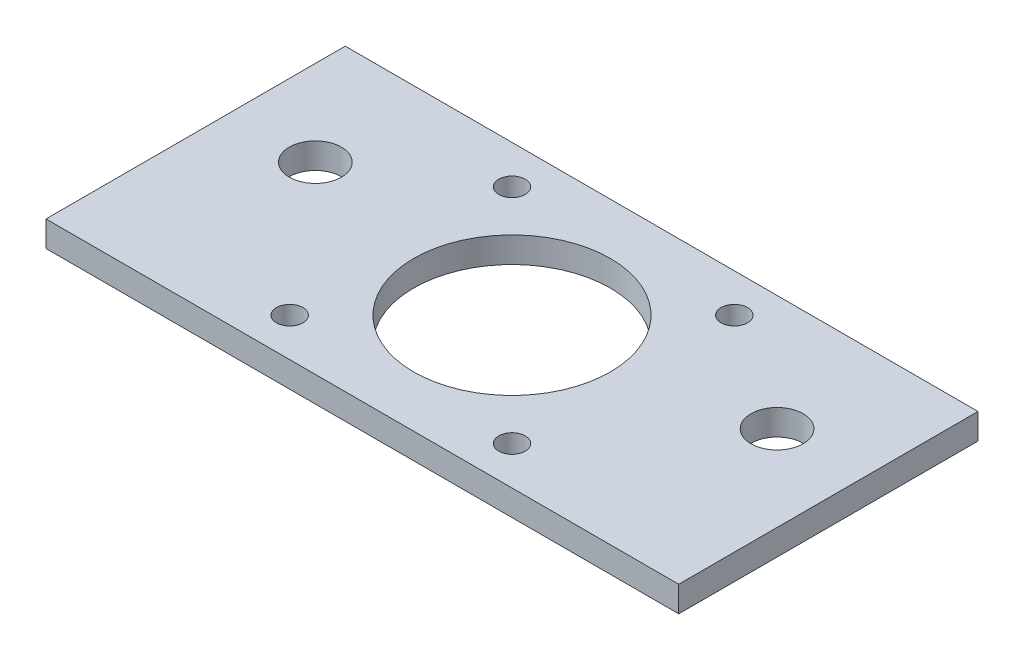
ISO-10303-21;
HEADER;
FILE_DESCRIPTION(('STEP AP214'),'2;1');
FILE_NAME('part.step','',(''),(''),'','','');
FILE_SCHEMA(('AUTOMOTIVE_DESIGN { 1 0 10303 214 1 1 1 1 }'));
ENDSEC;
DATA;
#1=APPLICATION_CONTEXT('core data for automotive mechanical design processes');
#2=APPLICATION_PROTOCOL_DEFINITION('international standard','automotive_design',2000,#1);
#3=PRODUCT_CONTEXT('',#1,'mechanical');
#4=PRODUCT('Part','Part','',(#3));
#5=PRODUCT_RELATED_PRODUCT_CATEGORY('part','',(#4));
#6=PRODUCT_DEFINITION_FORMATION('','',#4);
#7=PRODUCT_DEFINITION_CONTEXT('part definition',#1,'design');
#8=PRODUCT_DEFINITION('design','',#6,#7);
#9=PRODUCT_DEFINITION_SHAPE('','',#8);
#10=(LENGTH_UNIT() NAMED_UNIT(*) SI_UNIT(.MILLI.,.METRE.));
#11=(NAMED_UNIT(*) PLANE_ANGLE_UNIT() SI_UNIT($,.RADIAN.));
#12=(NAMED_UNIT(*) SI_UNIT($,.STERADIAN.) SOLID_ANGLE_UNIT());
#13=UNCERTAINTY_MEASURE_WITH_UNIT(LENGTH_MEASURE(1.E-05),#10,'distance_accuracy_value','');
#14=(GEOMETRIC_REPRESENTATION_CONTEXT(3) GLOBAL_UNCERTAINTY_ASSIGNED_CONTEXT((#13)) GLOBAL_UNIT_ASSIGNED_CONTEXT((#10,
#11,#12)) REPRESENTATION_CONTEXT('',''));
#15=CARTESIAN_POINT('',(0.,0.,0.));
#16=DIRECTION('',(0.,0.,1.));
#17=DIRECTION('',(1.,0.,0.));
#18=AXIS2_PLACEMENT_3D('',#15,#16,#17);
#19=CARTESIAN_POINT('',(37.,3.,-17.5));
#20=DIRECTION('',(-1.,0.,0.));
#21=DIRECTION('',(0.,0.,1.));
#22=AXIS2_PLACEMENT_3D('',#19,#20,#21);
#23=PLANE('',#22);
#24=DIRECTION('',(0.,0.,-1.));
#25=VECTOR('',#24,1.);
#26=CARTESIAN_POINT('',(37.,0.,-17.5));
#27=LINE('',#26,#25);
#28=CARTESIAN_POINT('',(37.,0.,17.5));
#29=VERTEX_POINT('',#28);
#30=CARTESIAN_POINT('',(37.,0.,-17.5));
#31=VERTEX_POINT('',#30);
#32=EDGE_CURVE('E109',#29,#31,#27,.T.);
#33=ORIENTED_EDGE('',*,*,#32,.T.);
#34=DIRECTION('',(0.,-1.,0.));
#35=VECTOR('',#34,1.);
#36=CARTESIAN_POINT('',(37.,3.,-17.5));
#37=LINE('',#36,#35);
#38=CARTESIAN_POINT('',(37.,3.,-17.5));
#39=VERTEX_POINT('',#38);
#40=EDGE_CURVE('E11',#39,#31,#37,.T.);
#41=ORIENTED_EDGE('',*,*,#40,.F.);
#42=DIRECTION('',(0.,0.,-1.));
#43=VECTOR('',#42,1.);
#44=CARTESIAN_POINT('',(37.,3.,-17.5));
#45=LINE('',#44,#43);
#46=CARTESIAN_POINT('',(37.,3.,17.5));
#47=VERTEX_POINT('',#46);
#48=EDGE_CURVE('E92',#47,#39,#45,.T.);
#49=ORIENTED_EDGE('',*,*,#48,.F.);
#50=DIRECTION('',(0.,-1.,0.));
#51=VECTOR('',#50,1.);
#52=CARTESIAN_POINT('',(37.,3.,17.5));
#53=LINE('',#52,#51);
#54=EDGE_CURVE('E105',#47,#29,#53,.T.);
#55=ORIENTED_EDGE('',*,*,#54,.T.);
#56=EDGE_LOOP('',(#33,#41,#49,#55));
#57=FACE_BOUND('',#56,.T.);
#58=ADVANCED_FACE('F38',(#57),#23,.F.);
#59=CARTESIAN_POINT('',(-37.,3.,-17.5));
#60=DIRECTION('',(0.,0.,1.));
#61=DIRECTION('',(1.,0.,0.));
#62=AXIS2_PLACEMENT_3D('',#59,#60,#61);
#63=PLANE('',#62);
#64=DIRECTION('',(-1.,0.,0.));
#65=VECTOR('',#64,1.);
#66=CARTESIAN_POINT('',(-37.,0.,-17.5));
#67=LINE('',#66,#65);
#68=CARTESIAN_POINT('',(-37.,0.,-17.5));
#69=VERTEX_POINT('',#68);
#70=EDGE_CURVE('E97',#31,#69,#67,.T.);
#71=ORIENTED_EDGE('',*,*,#70,.T.);
#72=DIRECTION('',(0.,-1.,0.));
#73=VECTOR('',#72,1.);
#74=CARTESIAN_POINT('',(-37.,3.,-17.5));
#75=LINE('',#74,#73);
#76=CARTESIAN_POINT('',(-37.,3.,-17.5));
#77=VERTEX_POINT('',#76);
#78=EDGE_CURVE('E48',#77,#69,#75,.T.);
#79=ORIENTED_EDGE('',*,*,#78,.F.);
#80=DIRECTION('',(-1.,0.,0.));
#81=VECTOR('',#80,1.);
#82=CARTESIAN_POINT('',(-37.,3.,-17.5));
#83=LINE('',#82,#81);
#84=EDGE_CURVE('E87',#39,#77,#83,.T.);
#85=ORIENTED_EDGE('',*,*,#84,.F.);
#86=ORIENTED_EDGE('',*,*,#40,.T.);
#87=EDGE_LOOP('',(#71,#79,#85,#86));
#88=FACE_BOUND('',#87,.T.);
#89=ADVANCED_FACE('F96',(#88),#63,.F.);
#90=CARTESIAN_POINT('',(-37.,3.,-17.5));
#91=DIRECTION('',(1.,0.,0.));
#92=DIRECTION('',(0.,0.,-1.));
#93=AXIS2_PLACEMENT_3D('',#90,#91,#92);
#94=PLANE('',#93);
#95=DIRECTION('',(0.,0.,1.));
#96=VECTOR('',#95,1.);
#97=CARTESIAN_POINT('',(-37.,0.,-17.5));
#98=LINE('',#97,#96);
#99=CARTESIAN_POINT('',(-37.,0.,17.5));
#100=VERTEX_POINT('',#99);
#101=EDGE_CURVE('E74',#69,#100,#98,.T.);
#102=ORIENTED_EDGE('',*,*,#101,.T.);
#103=DIRECTION('',(0.,-1.,0.));
#104=VECTOR('',#103,1.);
#105=CARTESIAN_POINT('',(-37.,3.,17.5));
#106=LINE('',#105,#104);
#107=CARTESIAN_POINT('',(-37.,3.,17.5));
#108=VERTEX_POINT('',#107);
#109=EDGE_CURVE('E99',#108,#100,#106,.T.);
#110=ORIENTED_EDGE('',*,*,#109,.F.);
#111=DIRECTION('',(0.,0.,1.));
#112=VECTOR('',#111,1.);
#113=CARTESIAN_POINT('',(-37.,3.,-17.5));
#114=LINE('',#113,#112);
#115=EDGE_CURVE('E90',#77,#108,#114,.T.);
#116=ORIENTED_EDGE('',*,*,#115,.F.);
#117=ORIENTED_EDGE('',*,*,#78,.T.);
#118=EDGE_LOOP('',(#102,#110,#116,#117));
#119=FACE_BOUND('',#118,.T.);
#120=ADVANCED_FACE('F101',(#119),#94,.F.);
#121=CARTESIAN_POINT('',(-37.,3.,17.5));
#122=DIRECTION('',(0.,0.,-1.));
#123=DIRECTION('',(-1.,0.,0.));
#124=AXIS2_PLACEMENT_3D('',#121,#122,#123);
#125=PLANE('',#124);
#126=DIRECTION('',(1.,0.,0.));
#127=VECTOR('',#126,1.);
#128=CARTESIAN_POINT('',(-37.,0.,17.5));
#129=LINE('',#128,#127);
#130=EDGE_CURVE('E80',#100,#29,#129,.T.);
#131=ORIENTED_EDGE('',*,*,#130,.T.);
#132=ORIENTED_EDGE('',*,*,#54,.F.);
#133=DIRECTION('',(1.,0.,0.));
#134=VECTOR('',#133,1.);
#135=CARTESIAN_POINT('',(-37.,3.,17.5));
#136=LINE('',#135,#134);
#137=EDGE_CURVE('E57',#108,#47,#136,.T.);
#138=ORIENTED_EDGE('',*,*,#137,.F.);
#139=ORIENTED_EDGE('',*,*,#109,.T.);
#140=EDGE_LOOP('',(#131,#132,#138,#139));
#141=FACE_BOUND('',#140,.T.);
#142=ADVANCED_FACE('F183',(#141),#125,.F.);
#143=CARTESIAN_POINT('',(0.,3.,0.));
#144=DIRECTION('',(0.,1.,0.));
#145=DIRECTION('',(0.,0.,1.));
#146=AXIS2_PLACEMENT_3D('',#143,#144,#145);
#147=PLANE('',#146);
#148=CARTESIAN_POINT('',(0.,3.,0.));
#149=DIRECTION('',(0.,1.,0.));
#150=DIRECTION('',(0.,0.,1.));
#151=AXIS2_PLACEMENT_3D('',#148,#149,#150);
#152=CIRCLE('',#151,11.5);
#153=CARTESIAN_POINT('',(0.,3.,11.5));
#154=VERTEX_POINT('',#153);
#155=EDGE_CURVE('E140',#154,#154,#152,.T.);
#156=ORIENTED_EDGE('',*,*,#155,.F.);
#157=EDGE_LOOP('',(#156));
#158=FACE_BOUND('',#157,.T.);
#159=CARTESIAN_POINT('',(-26.9999999999999,3.,-3.99999999999953));
#160=DIRECTION('',(0.,1.,0.));
#161=DIRECTION('',(0.,0.,1.));
#162=AXIS2_PLACEMENT_3D('',#159,#160,#161);
#163=CIRCLE('',#162,3.05);
#164=CARTESIAN_POINT('',(-26.9999999999999,3.,-0.949999999999527));
#165=VERTEX_POINT('',#164);
#166=EDGE_CURVE('E126',#165,#165,#163,.T.);
#167=ORIENTED_EDGE('',*,*,#166,.F.);
#168=EDGE_LOOP('',(#167));
#169=FACE_BOUND('',#168,.T.);
#170=CARTESIAN_POINT('',(27.,3.,-3.99999999999948));
#171=DIRECTION('',(0.,1.,0.));
#172=DIRECTION('',(0.,0.,1.));
#173=AXIS2_PLACEMENT_3D('',#170,#171,#172);
#174=CIRCLE('',#173,3.05);
#175=CARTESIAN_POINT('',(27.,3.,-0.949999999999474));
#176=VERTEX_POINT('',#175);
#177=EDGE_CURVE('E134',#176,#176,#174,.T.);
#178=ORIENTED_EDGE('',*,*,#177,.F.);
#179=EDGE_LOOP('',(#178));
#180=FACE_BOUND('',#179,.T.);
#181=CARTESIAN_POINT('',(-13.,3.,-13.));
#182=DIRECTION('',(0.,1.,0.));
#183=DIRECTION('',(0.,0.,1.));
#184=AXIS2_PLACEMENT_3D('',#181,#182,#183);
#185=CIRCLE('',#184,1.55);
#186=CARTESIAN_POINT('',(-13.,3.,-11.45));
#187=VERTEX_POINT('',#186);
#188=EDGE_CURVE('E113',#187,#187,#185,.T.);
#189=ORIENTED_EDGE('',*,*,#188,.F.);
#190=EDGE_LOOP('',(#189));
#191=FACE_BOUND('',#190,.T.);
#192=CARTESIAN_POINT('',(13.,3.,-13.));
#193=DIRECTION('',(0.,1.,0.));
#194=DIRECTION('',(0.,0.,1.));
#195=AXIS2_PLACEMENT_3D('',#192,#193,#194);
#196=CIRCLE('',#195,1.55);
#197=CARTESIAN_POINT('',(13.,3.,-11.45));
#198=VERTEX_POINT('',#197);
#199=EDGE_CURVE('E168',#198,#198,#196,.T.);
#200=ORIENTED_EDGE('',*,*,#199,.F.);
#201=EDGE_LOOP('',(#200));
#202=FACE_BOUND('',#201,.T.);
#203=CARTESIAN_POINT('',(13.,3.,13.));
#204=DIRECTION('',(0.,1.,0.));
#205=DIRECTION('',(0.,0.,1.));
#206=AXIS2_PLACEMENT_3D('',#203,#204,#205);
#207=CIRCLE('',#206,1.55);
#208=CARTESIAN_POINT('',(13.,3.,14.55));
#209=VERTEX_POINT('',#208);
#210=EDGE_CURVE('E164',#209,#209,#207,.T.);
#211=ORIENTED_EDGE('',*,*,#210,.F.);
#212=EDGE_LOOP('',(#211));
#213=FACE_BOUND('',#212,.T.);
#214=CARTESIAN_POINT('',(-13.,3.,13.));
#215=DIRECTION('',(0.,1.,0.));
#216=DIRECTION('',(0.,0.,1.));
#217=AXIS2_PLACEMENT_3D('',#214,#215,#216);
#218=CIRCLE('',#217,1.55);
#219=CARTESIAN_POINT('',(-13.,3.,14.55));
#220=VERTEX_POINT('',#219);
#221=EDGE_CURVE('E160',#220,#220,#218,.T.);
#222=ORIENTED_EDGE('',*,*,#221,.F.);
#223=EDGE_LOOP('',(#222));
#224=FACE_BOUND('',#223,.T.);
#225=ORIENTED_EDGE('',*,*,#48,.T.);
#226=ORIENTED_EDGE('',*,*,#84,.T.);
#227=ORIENTED_EDGE('',*,*,#115,.T.);
#228=ORIENTED_EDGE('',*,*,#137,.T.);
#229=EDGE_LOOP('',(#225,#226,#227,#228));
#230=FACE_BOUND('',#229,.T.);
#231=ADVANCED_FACE('F88',(#158,#169,#180,#191,#202,#213,#224,#230),#147,.T.);
#232=CARTESIAN_POINT('',(0.,0.,0.));
#233=DIRECTION('',(0.,1.,0.));
#234=DIRECTION('',(0.,0.,1.));
#235=AXIS2_PLACEMENT_3D('',#232,#233,#234);
#236=PLANE('',#235);
#237=CARTESIAN_POINT('',(0.,0.,0.));
#238=DIRECTION('',(0.,-1.,0.));
#239=DIRECTION('',(0.,0.,-1.));
#240=AXIS2_PLACEMENT_3D('',#237,#238,#239);
#241=CIRCLE('',#240,11.5);
#242=CARTESIAN_POINT('',(0.,0.,-11.5));
#243=VERTEX_POINT('',#242);
#244=EDGE_CURVE('E304',#243,#243,#241,.T.);
#245=ORIENTED_EDGE('',*,*,#244,.F.);
#246=EDGE_LOOP('',(#245));
#247=FACE_BOUND('',#246,.T.);
#248=CARTESIAN_POINT('',(-26.9999999999999,0.,-3.99999999999953));
#249=DIRECTION('',(0.,1.,0.));
#250=DIRECTION('',(0.,0.,1.));
#251=AXIS2_PLACEMENT_3D('',#248,#249,#250);
#252=CIRCLE('',#251,3.05);
#253=CARTESIAN_POINT('',(-26.9999999999999,0.,-0.949999999999527));
#254=VERTEX_POINT('',#253);
#255=EDGE_CURVE('E41',#254,#254,#252,.T.);
#256=ORIENTED_EDGE('',*,*,#255,.T.);
#257=EDGE_LOOP('',(#256));
#258=FACE_BOUND('',#257,.T.);
#259=CARTESIAN_POINT('',(27.,0.,-3.99999999999948));
#260=DIRECTION('',(0.,1.,0.));
#261=DIRECTION('',(0.,0.,1.));
#262=AXIS2_PLACEMENT_3D('',#259,#260,#261);
#263=CIRCLE('',#262,3.05);
#264=CARTESIAN_POINT('',(27.,0.,-0.949999999999474));
#265=VERTEX_POINT('',#264);
#266=EDGE_CURVE('E123',#265,#265,#263,.T.);
#267=ORIENTED_EDGE('',*,*,#266,.T.);
#268=EDGE_LOOP('',(#267));
#269=FACE_BOUND('',#268,.T.);
#270=CARTESIAN_POINT('',(-13.,0.,-13.));
#271=DIRECTION('',(0.,-1.,0.));
#272=DIRECTION('',(0.,0.,-1.));
#273=AXIS2_PLACEMENT_3D('',#270,#271,#272);
#274=CIRCLE('',#273,1.55);
#275=CARTESIAN_POINT('',(-13.,0.,-14.55));
#276=VERTEX_POINT('',#275);
#277=EDGE_CURVE('E132',#276,#276,#274,.T.);
#278=ORIENTED_EDGE('',*,*,#277,.F.);
#279=EDGE_LOOP('',(#278));
#280=FACE_BOUND('',#279,.T.);
#281=CARTESIAN_POINT('',(13.,0.,-13.));
#282=DIRECTION('',(0.,-1.,0.));
#283=DIRECTION('',(0.,0.,-1.));
#284=AXIS2_PLACEMENT_3D('',#281,#282,#283);
#285=CIRCLE('',#284,1.55);
#286=CARTESIAN_POINT('',(13.,0.,-14.55));
#287=VERTEX_POINT('',#286);
#288=EDGE_CURVE('E150',#287,#287,#285,.T.);
#289=ORIENTED_EDGE('',*,*,#288,.F.);
#290=EDGE_LOOP('',(#289));
#291=FACE_BOUND('',#290,.T.);
#292=CARTESIAN_POINT('',(13.,0.,13.));
#293=DIRECTION('',(0.,-1.,0.));
#294=DIRECTION('',(0.,0.,-1.));
#295=AXIS2_PLACEMENT_3D('',#292,#293,#294);
#296=CIRCLE('',#295,1.55);
#297=CARTESIAN_POINT('',(13.,0.,11.45));
#298=VERTEX_POINT('',#297);
#299=EDGE_CURVE('E145',#298,#298,#296,.T.);
#300=ORIENTED_EDGE('',*,*,#299,.F.);
#301=EDGE_LOOP('',(#300));
#302=FACE_BOUND('',#301,.T.);
#303=CARTESIAN_POINT('',(-13.,0.,13.));
#304=DIRECTION('',(0.,-1.,0.));
#305=DIRECTION('',(0.,0.,-1.));
#306=AXIS2_PLACEMENT_3D('',#303,#304,#305);
#307=CIRCLE('',#306,1.55);
#308=CARTESIAN_POINT('',(-13.,0.,11.45));
#309=VERTEX_POINT('',#308);
#310=EDGE_CURVE('E149',#309,#309,#307,.T.);
#311=ORIENTED_EDGE('',*,*,#310,.F.);
#312=EDGE_LOOP('',(#311));
#313=FACE_BOUND('',#312,.T.);
#314=ORIENTED_EDGE('',*,*,#32,.F.);
#315=ORIENTED_EDGE('',*,*,#130,.F.);
#316=ORIENTED_EDGE('',*,*,#101,.F.);
#317=ORIENTED_EDGE('',*,*,#70,.F.);
#318=EDGE_LOOP('',(#314,#315,#316,#317));
#319=FACE_BOUND('',#318,.T.);
#320=ADVANCED_FACE('F182',(#247,#258,#269,#280,#291,#302,#313,#319),#236,.F.);
#321=CARTESIAN_POINT('',(-13.,10.,13.));
#322=DIRECTION('',(0.,-1.,0.));
#323=DIRECTION('',(0.,0.,-1.));
#324=AXIS2_PLACEMENT_3D('',#321,#322,#323);
#325=CYLINDRICAL_SURFACE('',#324,1.55);
#326=ORIENTED_EDGE('',*,*,#221,.T.);
#327=EDGE_LOOP('',(#326));
#328=FACE_BOUND('',#327,.T.);
#329=ORIENTED_EDGE('',*,*,#310,.T.);
#330=EDGE_LOOP('',(#329));
#331=FACE_BOUND('',#330,.T.);
#332=ADVANCED_FACE('F192',(#328,#331),#325,.F.);
#333=CARTESIAN_POINT('',(13.,10.,13.));
#334=DIRECTION('',(0.,-1.,0.));
#335=DIRECTION('',(0.,0.,-1.));
#336=AXIS2_PLACEMENT_3D('',#333,#334,#335);
#337=CYLINDRICAL_SURFACE('',#336,1.55);
#338=ORIENTED_EDGE('',*,*,#210,.T.);
#339=EDGE_LOOP('',(#338));
#340=FACE_BOUND('',#339,.T.);
#341=ORIENTED_EDGE('',*,*,#299,.T.);
#342=EDGE_LOOP('',(#341));
#343=FACE_BOUND('',#342,.T.);
#344=ADVANCED_FACE('F195',(#340,#343),#337,.F.);
#345=CARTESIAN_POINT('',(13.,10.,-13.));
#346=DIRECTION('',(0.,-1.,0.));
#347=DIRECTION('',(0.,0.,-1.));
#348=AXIS2_PLACEMENT_3D('',#345,#346,#347);
#349=CYLINDRICAL_SURFACE('',#348,1.55);
#350=ORIENTED_EDGE('',*,*,#199,.T.);
#351=EDGE_LOOP('',(#350));
#352=FACE_BOUND('',#351,.T.);
#353=ORIENTED_EDGE('',*,*,#288,.T.);
#354=EDGE_LOOP('',(#353));
#355=FACE_BOUND('',#354,.T.);
#356=ADVANCED_FACE('F244',(#352,#355),#349,.F.);
#357=CARTESIAN_POINT('',(-13.,10.,-13.));
#358=DIRECTION('',(0.,-1.,0.));
#359=DIRECTION('',(0.,0.,-1.));
#360=AXIS2_PLACEMENT_3D('',#357,#358,#359);
#361=CYLINDRICAL_SURFACE('',#360,1.55);
#362=ORIENTED_EDGE('',*,*,#188,.T.);
#363=EDGE_LOOP('',(#362));
#364=FACE_BOUND('',#363,.T.);
#365=ORIENTED_EDGE('',*,*,#277,.T.);
#366=EDGE_LOOP('',(#365));
#367=FACE_BOUND('',#366,.T.);
#368=ADVANCED_FACE('F177',(#364,#367),#361,.F.);
#369=CARTESIAN_POINT('',(27.,-7.,-3.99999999999948));
#370=DIRECTION('',(0.,1.,0.));
#371=DIRECTION('',(0.,0.,1.));
#372=AXIS2_PLACEMENT_3D('',#369,#370,#371);
#373=CYLINDRICAL_SURFACE('',#372,3.05);
#374=ORIENTED_EDGE('',*,*,#177,.T.);
#375=EDGE_LOOP('',(#374));
#376=FACE_BOUND('',#375,.T.);
#377=ORIENTED_EDGE('',*,*,#266,.F.);
#378=EDGE_LOOP('',(#377));
#379=FACE_BOUND('',#378,.T.);
#380=ADVANCED_FACE('F263',(#376,#379),#373,.F.);
#381=CARTESIAN_POINT('',(-26.9999999999999,-7.,-3.99999999999953));
#382=DIRECTION('',(0.,1.,0.));
#383=DIRECTION('',(0.,0.,1.));
#384=AXIS2_PLACEMENT_3D('',#381,#382,#383);
#385=CYLINDRICAL_SURFACE('',#384,3.05);
#386=ORIENTED_EDGE('',*,*,#166,.T.);
#387=EDGE_LOOP('',(#386));
#388=FACE_BOUND('',#387,.T.);
#389=ORIENTED_EDGE('',*,*,#255,.F.);
#390=EDGE_LOOP('',(#389));
#391=FACE_BOUND('',#390,.T.);
#392=ADVANCED_FACE('F272',(#388,#391),#385,.F.);
#393=CARTESIAN_POINT('',(0.,10.,0.));
#394=DIRECTION('',(0.,-1.,0.));
#395=DIRECTION('',(0.,0.,-1.));
#396=AXIS2_PLACEMENT_3D('',#393,#394,#395);
#397=CYLINDRICAL_SURFACE('',#396,11.5);
#398=ORIENTED_EDGE('',*,*,#155,.T.);
#399=EDGE_LOOP('',(#398));
#400=FACE_BOUND('',#399,.T.);
#401=ORIENTED_EDGE('',*,*,#244,.T.);
#402=EDGE_LOOP('',(#401));
#403=FACE_BOUND('',#402,.T.);
#404=ADVANCED_FACE('F281',(#400,#403),#397,.F.);
#405=CLOSED_SHELL('',(#58,#89,#120,#142,#231,#320,#332,#344,#356,#368,#380,#392,#404));
#406=MANIFOLD_SOLID_BREP('B2',#405);
#407=ADVANCED_BREP_SHAPE_REPRESENTATION('',(#18,#406),#14);
#408=SHAPE_DEFINITION_REPRESENTATION(#9,#407);
ENDSEC;
END-ISO-10303-21;
